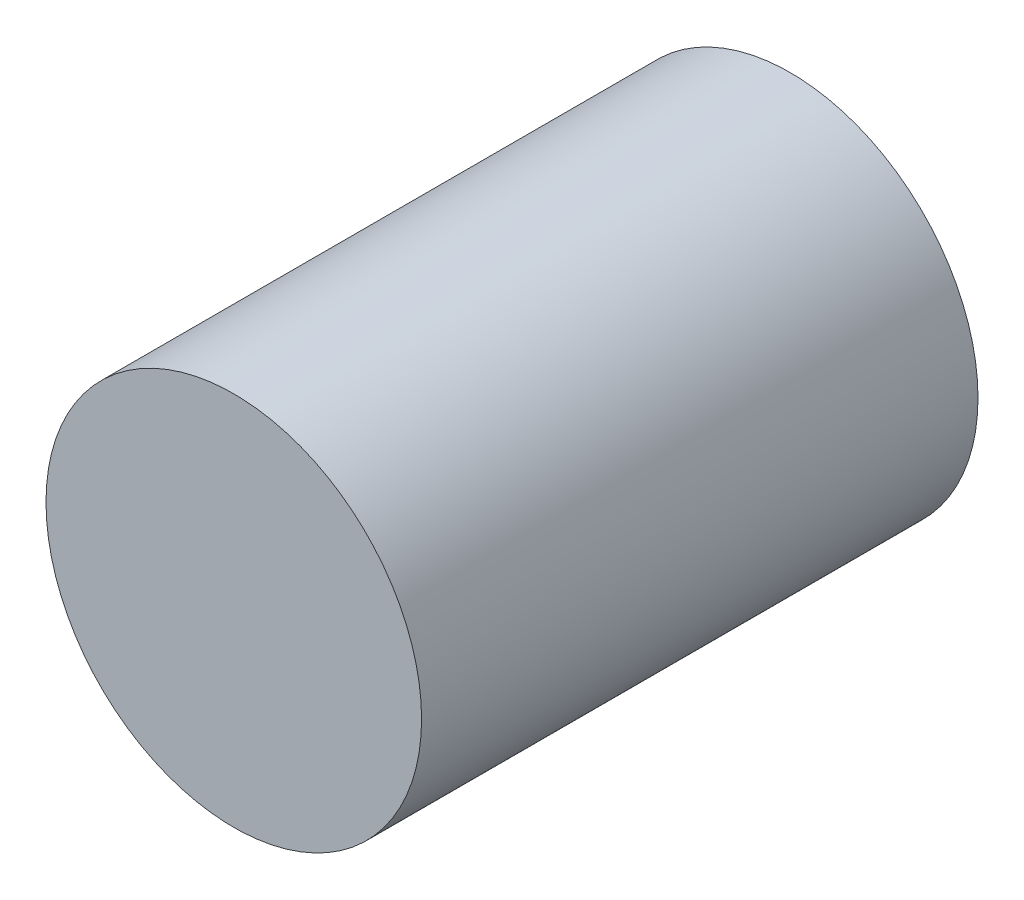
ISO-10303-21;
HEADER;
FILE_DESCRIPTION(('STEP AP214'),'2;1');
FILE_NAME('part.step','',(''),(''),'','','');
FILE_SCHEMA(('AUTOMOTIVE_DESIGN { 1 0 10303 214 1 1 1 1 }'));
ENDSEC;
DATA;
#1=APPLICATION_CONTEXT('core data for automotive mechanical design processes');
#2=APPLICATION_PROTOCOL_DEFINITION('international standard','automotive_design',2000,#1);
#3=PRODUCT_CONTEXT('',#1,'mechanical');
#4=PRODUCT('Part','Part','',(#3));
#5=PRODUCT_RELATED_PRODUCT_CATEGORY('part','',(#4));
#6=PRODUCT_DEFINITION_FORMATION('','',#4);
#7=PRODUCT_DEFINITION_CONTEXT('part definition',#1,'design');
#8=PRODUCT_DEFINITION('design','',#6,#7);
#9=PRODUCT_DEFINITION_SHAPE('','',#8);
#10=(LENGTH_UNIT() NAMED_UNIT(*) SI_UNIT(.MILLI.,.METRE.));
#11=(NAMED_UNIT(*) PLANE_ANGLE_UNIT() SI_UNIT($,.RADIAN.));
#12=(NAMED_UNIT(*) SI_UNIT($,.STERADIAN.) SOLID_ANGLE_UNIT());
#13=UNCERTAINTY_MEASURE_WITH_UNIT(LENGTH_MEASURE(1.E-05),#10,'distance_accuracy_value','');
#14=(GEOMETRIC_REPRESENTATION_CONTEXT(3) GLOBAL_UNCERTAINTY_ASSIGNED_CONTEXT((#13)) GLOBAL_UNIT_ASSIGNED_CONTEXT((#10,
#11,#12)) REPRESENTATION_CONTEXT('',''));
#15=CARTESIAN_POINT('',(0.,0.,0.));
#16=DIRECTION('',(0.,0.,1.));
#17=DIRECTION('',(1.,0.,0.));
#18=AXIS2_PLACEMENT_3D('',#15,#16,#17);
#19=CARTESIAN_POINT('',(1.3509,1.3509,4.0009));
#20=DIRECTION('',(0.,0.,1.));
#21=DIRECTION('',(1.,0.,0.));
#22=AXIS2_PLACEMENT_3D('',#19,#20,#21);
#23=PLANE('',#22);
#24=CARTESIAN_POINT('',(1.3509,1.3509,4.0009));
#25=DIRECTION('',(0.,0.,1.));
#26=DIRECTION('',(1.,0.,0.));
#27=AXIS2_PLACEMENT_3D('',#24,#25,#26);
#28=CIRCLE('',#27,1.35);
#29=CARTESIAN_POINT('',(2.7009,1.3509,4.0009));
#30=VERTEX_POINT('',#29);
#31=EDGE_CURVE('E16',#30,#30,#28,.F.);
#32=ORIENTED_EDGE('',*,*,#31,.F.);
#33=EDGE_LOOP('',(#32));
#34=FACE_BOUND('',#33,.T.);
#35=ADVANCED_FACE('F13',(#34),#23,.T.);
#36=CARTESIAN_POINT('',(1.3509,1.3509,0.0009000000000015));
#37=DIRECTION('',(0.,0.,1.));
#38=DIRECTION('',(1.,0.,0.));
#39=AXIS2_PLACEMENT_3D('',#36,#37,#38);
#40=PLANE('',#39);
#41=CARTESIAN_POINT('',(1.3509,1.3509,0.0009000000000015));
#42=DIRECTION('',(0.,0.,1.));
#43=DIRECTION('',(1.,0.,0.));
#44=AXIS2_PLACEMENT_3D('',#41,#42,#43);
#45=CIRCLE('',#44,1.35);
#46=CARTESIAN_POINT('',(2.7009,1.3509,0.0009000000000015));
#47=VERTEX_POINT('',#46);
#48=EDGE_CURVE('E8',#47,#47,#45,.T.);
#49=ORIENTED_EDGE('',*,*,#48,.F.);
#50=EDGE_LOOP('',(#49));
#51=FACE_BOUND('',#50,.T.);
#52=ADVANCED_FACE('F28',(#51),#40,.F.);
#53=CARTESIAN_POINT('',(1.3509,1.3509,0.0009000000000015));
#54=DIRECTION('',(0.,0.,1.));
#55=DIRECTION('',(1.,0.,0.));
#56=AXIS2_PLACEMENT_3D('',#53,#54,#55);
#57=CYLINDRICAL_SURFACE('',#56,1.35);
#58=ORIENTED_EDGE('',*,*,#48,.T.);
#59=EDGE_LOOP('',(#58));
#60=FACE_BOUND('',#59,.T.);
#61=ORIENTED_EDGE('',*,*,#31,.T.);
#62=EDGE_LOOP('',(#61));
#63=FACE_BOUND('',#62,.T.);
#64=ADVANCED_FACE('F25',(#60,#63),#57,.T.);
#65=CLOSED_SHELL('',(#35,#52,#64));
#66=MANIFOLD_SOLID_BREP('B1',#65);
#67=ADVANCED_BREP_SHAPE_REPRESENTATION('',(#18,#66),#14);
#68=SHAPE_DEFINITION_REPRESENTATION(#9,#67);
ENDSEC;
END-ISO-10303-21;
